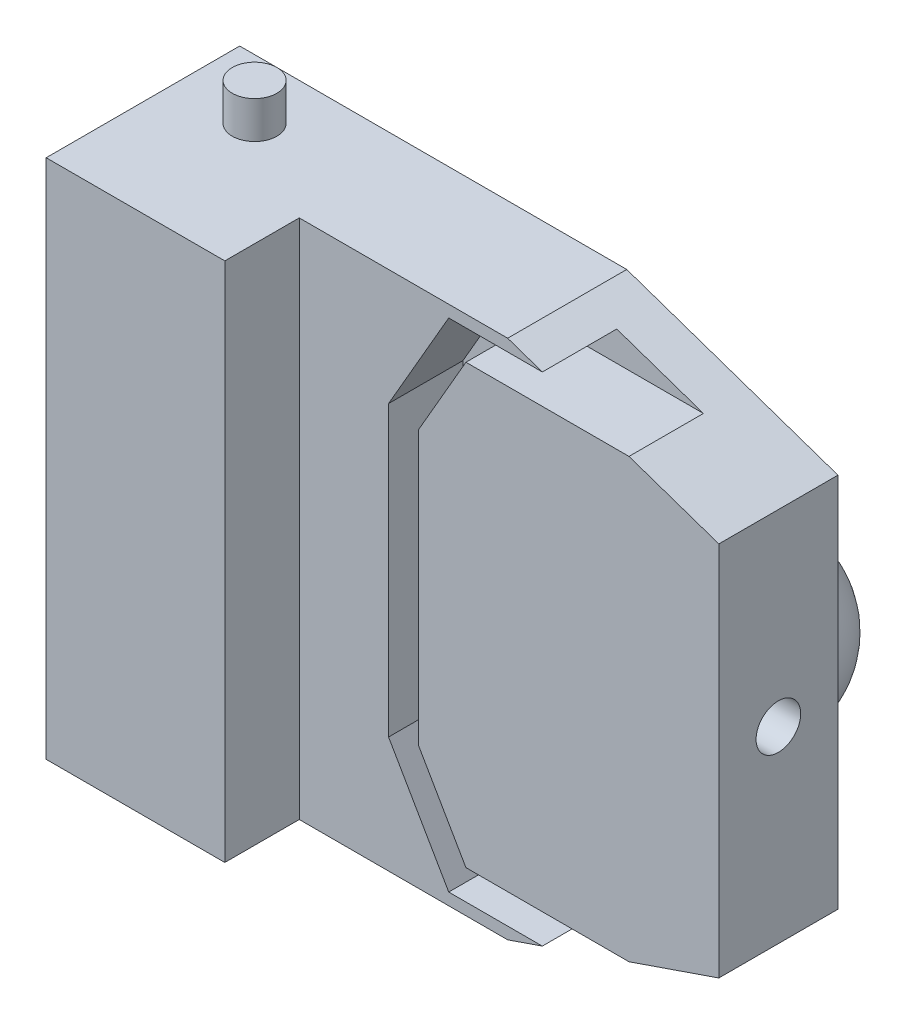
ISO-10303-21;
HEADER;
FILE_DESCRIPTION(('STEP AP214'),'2;1');
FILE_NAME('part.step','',(''),(''),'','','');
FILE_SCHEMA(('AUTOMOTIVE_DESIGN { 1 0 10303 214 1 1 1 1 }'));
ENDSEC;
DATA;
#1=APPLICATION_CONTEXT('core data for automotive mechanical design processes');
#2=APPLICATION_PROTOCOL_DEFINITION('international standard','automotive_design',2000,#1);
#3=PRODUCT_CONTEXT('',#1,'mechanical');
#4=PRODUCT('Part','Part','',(#3));
#5=PRODUCT_RELATED_PRODUCT_CATEGORY('part','',(#4));
#6=PRODUCT_DEFINITION_FORMATION('','',#4);
#7=PRODUCT_DEFINITION_CONTEXT('part definition',#1,'design');
#8=PRODUCT_DEFINITION('design','',#6,#7);
#9=PRODUCT_DEFINITION_SHAPE('','',#8);
#10=(LENGTH_UNIT() NAMED_UNIT(*) SI_UNIT(.MILLI.,.METRE.));
#11=(NAMED_UNIT(*) PLANE_ANGLE_UNIT() SI_UNIT($,.RADIAN.));
#12=(NAMED_UNIT(*) SI_UNIT($,.STERADIAN.) SOLID_ANGLE_UNIT());
#13=UNCERTAINTY_MEASURE_WITH_UNIT(LENGTH_MEASURE(1.E-05),#10,'distance_accuracy_value','');
#14=(GEOMETRIC_REPRESENTATION_CONTEXT(3) GLOBAL_UNCERTAINTY_ASSIGNED_CONTEXT((#13)) GLOBAL_UNIT_ASSIGNED_CONTEXT((#10,
#11,#12)) REPRESENTATION_CONTEXT('',''));
#15=CARTESIAN_POINT('',(0.,0.,0.));
#16=DIRECTION('',(0.,0.,1.));
#17=DIRECTION('',(1.,0.,0.));
#18=AXIS2_PLACEMENT_3D('',#15,#16,#17);
#19=CARTESIAN_POINT('',(0.,0.,80.));
#20=DIRECTION('',(0.,0.,-1.));
#21=DIRECTION('',(-1.,0.,0.));
#22=AXIS2_PLACEMENT_3D('',#19,#20,#21);
#23=PLANE('',#22);
#24=DIRECTION('',(0.,1.,0.));
#25=VECTOR('',#24,1.);
#26=CARTESIAN_POINT('',(-140.,0.,80.));
#27=LINE('',#26,#25);
#28=CARTESIAN_POINT('',(-140.,-350.,80.));
#29=VERTEX_POINT('',#28);
#30=CARTESIAN_POINT('',(-140.,0.,80.));
#31=VERTEX_POINT('',#30);
#32=EDGE_CURVE('E195',#29,#31,#27,.T.);
#33=ORIENTED_EDGE('',*,*,#32,.F.);
#34=DIRECTION('',(1.,0.,0.));
#35=VECTOR('',#34,1.);
#36=CARTESIAN_POINT('',(-260.,-350.,80.));
#37=LINE('',#36,#35);
#38=CARTESIAN_POINT('',(0.,-350.,80.));
#39=VERTEX_POINT('',#38);
#40=EDGE_CURVE('E316',#29,#39,#37,.T.);
#41=ORIENTED_EDGE('',*,*,#40,.T.);
#42=DIRECTION('',(0.945753856911225,0.324884044141201,0.));
#43=VECTOR('',#42,1.);
#44=CARTESIAN_POINT('',(141.863078536684,-301.26739337882,80.));
#45=LINE('',#44,#43);
#46=CARTESIAN_POINT('',(23.2884039451364,-342.,80.));
#47=VERTEX_POINT('',#46);
#48=EDGE_CURVE('E319',#39,#47,#45,.T.);
#49=ORIENTED_EDGE('',*,*,#48,.T.);
#50=DIRECTION('',(-1.,0.,0.));
#51=VECTOR('',#50,1.);
#52=CARTESIAN_POINT('',(23.2884039451364,-342.,80.));
#53=LINE('',#52,#51);
#54=CARTESIAN_POINT('',(-39.5854811567264,-342.,80.));
#55=VERTEX_POINT('',#54);
#56=EDGE_CURVE('E210',#47,#55,#53,.T.);
#57=ORIENTED_EDGE('',*,*,#56,.T.);
#58=DIRECTION('',(-0.499999999999998,0.86602540378444,0.));
#59=VECTOR('',#58,1.);
#60=CARTESIAN_POINT('',(-39.5854811567264,-342.,80.));
#61=LINE('',#60,#59);
#62=CARTESIAN_POINT('',(-80.,-272.,80.));
#63=VERTEX_POINT('',#62);
#64=EDGE_CURVE('E262',#55,#63,#61,.T.);
#65=ORIENTED_EDGE('',*,*,#64,.T.);
#66=DIRECTION('',(0.,1.,0.));
#67=VECTOR('',#66,1.);
#68=CARTESIAN_POINT('',(-80.,-272.,80.));
#69=LINE('',#68,#67);
#70=CARTESIAN_POINT('',(-80.,-78.,80.));
#71=VERTEX_POINT('',#70);
#72=EDGE_CURVE('E259',#63,#71,#69,.T.);
#73=ORIENTED_EDGE('',*,*,#72,.T.);
#74=DIRECTION('',(-0.499999999999998,-0.86602540378444,0.));
#75=VECTOR('',#74,1.);
#76=CARTESIAN_POINT('',(-39.5854811567264,-8.00000000000001,80.));
#77=LINE('',#76,#75);
#78=CARTESIAN_POINT('',(-39.5854811567264,-8.00000000000001,80.));
#79=VERTEX_POINT('',#78);
#80=EDGE_CURVE('E256',#79,#71,#77,.T.);
#81=ORIENTED_EDGE('',*,*,#80,.F.);
#82=DIRECTION('',(-1.,0.,0.));
#83=VECTOR('',#82,1.);
#84=CARTESIAN_POINT('',(23.2884039451364,-8.00000000000001,80.));
#85=LINE('',#84,#83);
#86=CARTESIAN_POINT('',(23.2884039451364,-8.00000000000001,80.));
#87=VERTEX_POINT('',#86);
#88=EDGE_CURVE('E253',#87,#79,#85,.T.);
#89=ORIENTED_EDGE('',*,*,#88,.F.);
#90=DIRECTION('',(-0.945753856911225,0.324884044141201,0.));
#91=VECTOR('',#90,1.);
#92=CARTESIAN_POINT('',(0.,0.,80.));
#93=LINE('',#92,#91);
#94=CARTESIAN_POINT('',(0.,0.,80.));
#95=VERTEX_POINT('',#94);
#96=EDGE_CURVE('E314',#87,#95,#93,.T.);
#97=ORIENTED_EDGE('',*,*,#96,.T.);
#98=DIRECTION('',(-1.,0.,0.));
#99=VECTOR('',#98,1.);
#100=CARTESIAN_POINT('',(0.,0.,80.));
#101=LINE('',#100,#99);
#102=EDGE_CURVE('E53',#95,#31,#101,.T.);
#103=ORIENTED_EDGE('',*,*,#102,.T.);
#104=EDGE_LOOP('',(#33,#41,#49,#57,#65,#73,#81,#89,#97,#103));
#105=FACE_BOUND('',#104,.T.);
#106=ADVANCED_FACE('F38',(#105),#23,.F.);
#107=CARTESIAN_POINT('',(0.,0.,80.));
#108=DIRECTION('',(-0.324884044141201,-0.945753856911225,0.));
#109=DIRECTION('',(0.945753856911225,-0.324884044141201,0.));
#110=AXIS2_PLACEMENT_3D('',#107,#108,#109);
#111=PLANE('',#110);
#112=ORIENTED_EDGE('',*,*,#96,.F.);
#113=DIRECTION('',(0.,0.,1.));
#114=VECTOR('',#113,1.);
#115=CARTESIAN_POINT('',(23.2884039451364,-8.00000000000001,30.));
#116=LINE('',#115,#114);
#117=CARTESIAN_POINT('',(23.2884039451364,-8.00000000000001,30.));
#118=VERTEX_POINT('',#117);
#119=EDGE_CURVE('E281',#118,#87,#116,.T.);
#120=ORIENTED_EDGE('',*,*,#119,.F.);
#121=DIRECTION('',(0.945753856911225,-0.324884044141201,0.));
#122=VECTOR('',#121,1.);
#123=CARTESIAN_POINT('',(23.2884039451364,-8.00000000000001,30.));
#124=LINE('',#123,#122);
#125=CARTESIAN_POINT('',(81.5094138079772,-28.,30.));
#126=VERTEX_POINT('',#125);
#127=EDGE_CURVE('E222',#118,#126,#124,.T.);
#128=ORIENTED_EDGE('',*,*,#127,.T.);
#129=DIRECTION('',(0.,0.,1.));
#130=VECTOR('',#129,1.);
#131=CARTESIAN_POINT('',(81.5094138079772,-28.,30.));
#132=LINE('',#131,#130);
#133=CARTESIAN_POINT('',(81.5094138079772,-28.,80.));
#134=VERTEX_POINT('',#133);
#135=EDGE_CURVE('E283',#126,#134,#132,.T.);
#136=ORIENTED_EDGE('',*,*,#135,.T.);
#137=CARTESIAN_POINT('',(141.863078536684,-48.7326066211802,80.));
#138=VERTEX_POINT('',#137);
#139=EDGE_CURVE('E311',#138,#134,#93,.T.);
#140=ORIENTED_EDGE('',*,*,#139,.F.);
#141=DIRECTION('',(0.,0.,-1.));
#142=VECTOR('',#141,1.);
#143=CARTESIAN_POINT('',(141.863078536684,-48.7326066211802,80.));
#144=LINE('',#143,#142);
#145=CARTESIAN_POINT('',(141.863078536684,-48.7326066211802,0.));
#146=VERTEX_POINT('',#145);
#147=EDGE_CURVE('E324',#138,#146,#144,.T.);
#148=ORIENTED_EDGE('',*,*,#147,.T.);
#149=DIRECTION('',(-0.945753856911225,0.324884044141201,0.));
#150=VECTOR('',#149,1.);
#151=CARTESIAN_POINT('',(0.,0.,0.));
#152=LINE('',#151,#150);
#153=CARTESIAN_POINT('',(0.,0.,0.));
#154=VERTEX_POINT('',#153);
#155=EDGE_CURVE('E308',#146,#154,#152,.T.);
#156=ORIENTED_EDGE('',*,*,#155,.T.);
#157=DIRECTION('',(0.,0.,-1.));
#158=VECTOR('',#157,1.);
#159=CARTESIAN_POINT('',(0.,0.,80.));
#160=LINE('',#159,#158);
#161=EDGE_CURVE('E11',#95,#154,#160,.T.);
#162=ORIENTED_EDGE('',*,*,#161,.F.);
#163=EDGE_LOOP('',(#112,#120,#128,#136,#140,#148,#156,#162));
#164=FACE_BOUND('',#163,.T.);
#165=ADVANCED_FACE('F40',(#164),#111,.F.);
#166=CARTESIAN_POINT('',(0.,0.,80.));
#167=DIRECTION('',(0.,-1.,0.));
#168=DIRECTION('',(0.,0.,-1.));
#169=AXIS2_PLACEMENT_3D('',#166,#167,#168);
#170=PLANE('',#169);
#171=CARTESIAN_POINT('',(-210.,0.,40.));
#172=DIRECTION('',(0.,-1.,0.));
#173=DIRECTION('',(0.,0.,-1.));
#174=AXIS2_PLACEMENT_3D('',#171,#172,#173);
#175=CIRCLE('',#174,15.);
#176=CARTESIAN_POINT('',(-210.,0.,25.));
#177=VERTEX_POINT('',#176);
#178=EDGE_CURVE('E296',#177,#177,#175,.T.);
#179=ORIENTED_EDGE('',*,*,#178,.T.);
#180=EDGE_LOOP('',(#179));
#181=FACE_BOUND('',#180,.T.);
#182=DIRECTION('',(-1.,0.,0.));
#183=VECTOR('',#182,1.);
#184=CARTESIAN_POINT('',(0.,0.,0.));
#185=LINE('',#184,#183);
#186=CARTESIAN_POINT('',(-260.,0.,0.));
#187=VERTEX_POINT('',#186);
#188=EDGE_CURVE('E327',#154,#187,#185,.T.);
#189=ORIENTED_EDGE('',*,*,#188,.T.);
#190=DIRECTION('',(0.,0.,-1.));
#191=VECTOR('',#190,1.);
#192=CARTESIAN_POINT('',(-260.,0.,80.));
#193=LINE('',#192,#191);
#194=CARTESIAN_POINT('',(-260.,0.,130.));
#195=VERTEX_POINT('',#194);
#196=EDGE_CURVE('E46',#195,#187,#193,.T.);
#197=ORIENTED_EDGE('',*,*,#196,.F.);
#198=DIRECTION('',(-1.,0.,0.));
#199=VECTOR('',#198,1.);
#200=CARTESIAN_POINT('',(-140.,0.,130.));
#201=LINE('',#200,#199);
#202=CARTESIAN_POINT('',(-140.,0.,130.));
#203=VERTEX_POINT('',#202);
#204=EDGE_CURVE('E175',#203,#195,#201,.T.);
#205=ORIENTED_EDGE('',*,*,#204,.F.);
#206=DIRECTION('',(0.,0.,-1.));
#207=VECTOR('',#206,1.);
#208=CARTESIAN_POINT('',(-140.,0.,130.));
#209=LINE('',#208,#207);
#210=EDGE_CURVE('E179',#203,#31,#209,.T.);
#211=ORIENTED_EDGE('',*,*,#210,.T.);
#212=ORIENTED_EDGE('',*,*,#102,.F.);
#213=ORIENTED_EDGE('',*,*,#161,.T.);
#214=EDGE_LOOP('',(#189,#197,#205,#211,#212,#213));
#215=FACE_BOUND('',#214,.T.);
#216=ADVANCED_FACE('F177',(#181,#215),#170,.F.);
#217=CARTESIAN_POINT('',(-260.,0.,80.));
#218=DIRECTION('',(1.,0.,0.));
#219=DIRECTION('',(0.,0.,-1.));
#220=AXIS2_PLACEMENT_3D('',#217,#218,#219);
#221=PLANE('',#220);
#222=DIRECTION('',(0.,-1.,0.));
#223=VECTOR('',#222,1.);
#224=CARTESIAN_POINT('',(-260.,0.,0.));
#225=LINE('',#224,#223);
#226=CARTESIAN_POINT('',(-260.,-350.,0.));
#227=VERTEX_POINT('',#226);
#228=EDGE_CURVE('E329',#187,#227,#225,.T.);
#229=ORIENTED_EDGE('',*,*,#228,.T.);
#230=DIRECTION('',(0.,0.,-1.));
#231=VECTOR('',#230,1.);
#232=CARTESIAN_POINT('',(-260.,-350.,80.));
#233=LINE('',#232,#231);
#234=CARTESIAN_POINT('',(-260.,-350.,130.));
#235=VERTEX_POINT('',#234);
#236=EDGE_CURVE('E345',#235,#227,#233,.T.);
#237=ORIENTED_EDGE('',*,*,#236,.F.);
#238=DIRECTION('',(0.,-1.,0.));
#239=VECTOR('',#238,1.);
#240=CARTESIAN_POINT('',(-260.,0.,130.));
#241=LINE('',#240,#239);
#242=EDGE_CURVE('E185',#195,#235,#241,.T.);
#243=ORIENTED_EDGE('',*,*,#242,.F.);
#244=ORIENTED_EDGE('',*,*,#196,.T.);
#245=EDGE_LOOP('',(#229,#237,#243,#244));
#246=FACE_BOUND('',#245,.T.);
#247=ADVANCED_FACE('F349',(#246),#221,.F.);
#248=CARTESIAN_POINT('',(-260.,-350.,80.));
#249=DIRECTION('',(0.,1.,0.));
#250=DIRECTION('',(0.,0.,1.));
#251=AXIS2_PLACEMENT_3D('',#248,#249,#250);
#252=PLANE('',#251);
#253=CARTESIAN_POINT('',(-210.,-350.,40.));
#254=DIRECTION('',(0.,1.,0.));
#255=DIRECTION('',(0.,0.,1.));
#256=AXIS2_PLACEMENT_3D('',#253,#254,#255);
#257=CIRCLE('',#256,15.);
#258=CARTESIAN_POINT('',(-210.,-350.,55.));
#259=VERTEX_POINT('',#258);
#260=EDGE_CURVE('E302',#259,#259,#257,.T.);
#261=ORIENTED_EDGE('',*,*,#260,.T.);
#262=EDGE_LOOP('',(#261));
#263=FACE_BOUND('',#262,.T.);
#264=DIRECTION('',(1.,0.,0.));
#265=VECTOR('',#264,1.);
#266=CARTESIAN_POINT('',(-260.,-350.,0.));
#267=LINE('',#266,#265);
#268=CARTESIAN_POINT('',(0.,-350.,0.));
#269=VERTEX_POINT('',#268);
#270=EDGE_CURVE('E331',#227,#269,#267,.T.);
#271=ORIENTED_EDGE('',*,*,#270,.T.);
#272=DIRECTION('',(0.,0.,-1.));
#273=VECTOR('',#272,1.);
#274=CARTESIAN_POINT('',(0.,-350.,80.));
#275=LINE('',#274,#273);
#276=EDGE_CURVE('E342',#39,#269,#275,.T.);
#277=ORIENTED_EDGE('',*,*,#276,.F.);
#278=ORIENTED_EDGE('',*,*,#40,.F.);
#279=DIRECTION('',(0.,0.,-1.));
#280=VECTOR('',#279,1.);
#281=CARTESIAN_POINT('',(-140.,-350.,130.));
#282=LINE('',#281,#280);
#283=CARTESIAN_POINT('',(-140.,-350.,130.));
#284=VERTEX_POINT('',#283);
#285=EDGE_CURVE('E199',#284,#29,#282,.T.);
#286=ORIENTED_EDGE('',*,*,#285,.F.);
#287=DIRECTION('',(1.,0.,0.));
#288=VECTOR('',#287,1.);
#289=CARTESIAN_POINT('',(-140.,-350.,130.));
#290=LINE('',#289,#288);
#291=EDGE_CURVE('E191',#235,#284,#290,.T.);
#292=ORIENTED_EDGE('',*,*,#291,.F.);
#293=ORIENTED_EDGE('',*,*,#236,.T.);
#294=EDGE_LOOP('',(#271,#277,#278,#286,#292,#293));
#295=FACE_BOUND('',#294,.T.);
#296=ADVANCED_FACE('F358',(#263,#295),#252,.F.);
#297=CARTESIAN_POINT('',(141.863078536684,-301.26739337882,80.));
#298=DIRECTION('',(-0.324884044141201,0.945753856911225,0.));
#299=DIRECTION('',(-0.945753856911225,-0.324884044141201,0.));
#300=AXIS2_PLACEMENT_3D('',#297,#298,#299);
#301=PLANE('',#300);
#302=CARTESIAN_POINT('',(81.5094138079773,-322.,80.));
#303=VERTEX_POINT('',#302);
#304=CARTESIAN_POINT('',(141.863078536684,-301.26739337882,80.));
#305=VERTEX_POINT('',#304);
#306=EDGE_CURVE('E318',#303,#305,#45,.T.);
#307=ORIENTED_EDGE('',*,*,#306,.F.);
#308=DIRECTION('',(0.,0.,1.));
#309=VECTOR('',#308,1.);
#310=CARTESIAN_POINT('',(81.5094138079773,-322.,30.));
#311=LINE('',#310,#309);
#312=CARTESIAN_POINT('',(81.5094138079773,-322.,30.));
#313=VERTEX_POINT('',#312);
#314=EDGE_CURVE('E267',#313,#303,#311,.T.);
#315=ORIENTED_EDGE('',*,*,#314,.F.);
#316=DIRECTION('',(0.945753856911225,0.324884044141201,0.));
#317=VECTOR('',#316,1.);
#318=CARTESIAN_POINT('',(23.2884039451364,-342.,30.));
#319=LINE('',#318,#317);
#320=CARTESIAN_POINT('',(23.2884039451364,-342.,30.));
#321=VERTEX_POINT('',#320);
#322=EDGE_CURVE('E237',#321,#313,#319,.T.);
#323=ORIENTED_EDGE('',*,*,#322,.F.);
#324=DIRECTION('',(0.,0.,1.));
#325=VECTOR('',#324,1.);
#326=CARTESIAN_POINT('',(23.2884039451364,-342.,30.));
#327=LINE('',#326,#325);
#328=EDGE_CURVE('E270',#321,#47,#327,.T.);
#329=ORIENTED_EDGE('',*,*,#328,.T.);
#330=ORIENTED_EDGE('',*,*,#48,.F.);
#331=ORIENTED_EDGE('',*,*,#276,.T.);
#332=DIRECTION('',(0.945753856911225,0.324884044141201,0.));
#333=VECTOR('',#332,1.);
#334=CARTESIAN_POINT('',(141.863078536684,-301.26739337882,0.));
#335=LINE('',#334,#333);
#336=CARTESIAN_POINT('',(141.863078536684,-301.26739337882,0.));
#337=VERTEX_POINT('',#336);
#338=EDGE_CURVE('E333',#269,#337,#335,.T.);
#339=ORIENTED_EDGE('',*,*,#338,.T.);
#340=DIRECTION('',(0.,0.,-1.));
#341=VECTOR('',#340,1.);
#342=CARTESIAN_POINT('',(141.863078536684,-301.26739337882,80.));
#343=LINE('',#342,#341);
#344=EDGE_CURVE('E339',#305,#337,#343,.T.);
#345=ORIENTED_EDGE('',*,*,#344,.F.);
#346=EDGE_LOOP('',(#307,#315,#323,#329,#330,#331,#339,#345));
#347=FACE_BOUND('',#346,.T.);
#348=ADVANCED_FACE('F362',(#347),#301,.F.);
#349=CARTESIAN_POINT('',(141.863078536684,-48.7326066211802,80.));
#350=DIRECTION('',(-1.,0.,0.));
#351=DIRECTION('',(0.,0.,1.));
#352=AXIS2_PLACEMENT_3D('',#349,#350,#351);
#353=PLANE('',#352);
#354=CARTESIAN_POINT('',(141.863078536684,-175.,40.));
#355=DIRECTION('',(1.,0.,0.));
#356=DIRECTION('',(0.,0.,-1.));
#357=AXIS2_PLACEMENT_3D('',#354,#355,#356);
#358=CIRCLE('',#357,15.);
#359=CARTESIAN_POINT('',(141.863078536684,-175.,25.));
#360=VERTEX_POINT('',#359);
#361=EDGE_CURVE('E269',#360,#360,#358,.T.);
#362=ORIENTED_EDGE('',*,*,#361,.F.);
#363=EDGE_LOOP('',(#362));
#364=FACE_BOUND('',#363,.T.);
#365=DIRECTION('',(0.,1.,0.));
#366=VECTOR('',#365,1.);
#367=CARTESIAN_POINT('',(141.863078536684,-48.7326066211802,0.));
#368=LINE('',#367,#366);
#369=EDGE_CURVE('E335',#337,#146,#368,.T.);
#370=ORIENTED_EDGE('',*,*,#369,.T.);
#371=ORIENTED_EDGE('',*,*,#147,.F.);
#372=DIRECTION('',(0.,1.,0.));
#373=VECTOR('',#372,1.);
#374=CARTESIAN_POINT('',(141.863078536684,-48.7326066211802,80.));
#375=LINE('',#374,#373);
#376=EDGE_CURVE('E322',#305,#138,#375,.T.);
#377=ORIENTED_EDGE('',*,*,#376,.F.);
#378=ORIENTED_EDGE('',*,*,#344,.T.);
#379=EDGE_LOOP('',(#370,#371,#377,#378));
#380=FACE_BOUND('',#379,.T.);
#381=ADVANCED_FACE('F396',(#364,#380),#353,.F.);
#382=DIRECTION('',(-0.499999999999998,0.866025403784439,0.));
#383=VECTOR('',#382,1.);
#384=CARTESIAN_POINT('',(-28.0384757729339,-322.,80.));
#385=LINE('',#384,#383);
#386=CARTESIAN_POINT('',(-28.0384757729339,-322.,80.));
#387=VERTEX_POINT('',#386);
#388=CARTESIAN_POINT('',(-60.,-266.641016151378,80.));
#389=VERTEX_POINT('',#388);
#390=EDGE_CURVE('E242',#387,#389,#385,.T.);
#391=ORIENTED_EDGE('',*,*,#390,.F.);
#392=DIRECTION('',(-1.,0.,0.));
#393=VECTOR('',#392,1.);
#394=CARTESIAN_POINT('',(81.5094138079773,-322.,80.));
#395=LINE('',#394,#393);
#396=EDGE_CURVE('E61',#303,#387,#395,.T.);
#397=ORIENTED_EDGE('',*,*,#396,.F.);
#398=ORIENTED_EDGE('',*,*,#306,.T.);
#399=ORIENTED_EDGE('',*,*,#376,.T.);
#400=ORIENTED_EDGE('',*,*,#139,.T.);
#401=DIRECTION('',(1.,0.,0.));
#402=VECTOR('',#401,1.);
#403=CARTESIAN_POINT('',(-28.0384757729339,-28.,80.));
#404=LINE('',#403,#402);
#405=CARTESIAN_POINT('',(-28.0384757729339,-28.,80.));
#406=VERTEX_POINT('',#405);
#407=EDGE_CURVE('E251',#406,#134,#404,.T.);
#408=ORIENTED_EDGE('',*,*,#407,.F.);
#409=DIRECTION('',(0.499999999999998,0.86602540378444,0.));
#410=VECTOR('',#409,1.);
#411=CARTESIAN_POINT('',(-60.,-83.3589838486224,80.));
#412=LINE('',#411,#410);
#413=CARTESIAN_POINT('',(-60.,-83.3589838486224,80.));
#414=VERTEX_POINT('',#413);
#415=EDGE_CURVE('E248',#414,#406,#412,.T.);
#416=ORIENTED_EDGE('',*,*,#415,.F.);
#417=DIRECTION('',(0.,1.,0.));
#418=VECTOR('',#417,1.);
#419=CARTESIAN_POINT('',(-60.,-266.641016151378,80.));
#420=LINE('',#419,#418);
#421=EDGE_CURVE('E245',#389,#414,#420,.T.);
#422=ORIENTED_EDGE('',*,*,#421,.F.);
#423=EDGE_LOOP('',(#391,#397,#398,#399,#400,#408,#416,#422));
#424=FACE_BOUND('',#423,.T.);
#425=ADVANCED_FACE('F401',(#424),#23,.F.);
#426=CARTESIAN_POINT('',(0.,0.,0.));
#427=DIRECTION('',(0.,0.,-1.));
#428=DIRECTION('',(-1.,0.,0.));
#429=AXIS2_PLACEMENT_3D('',#426,#427,#428);
#430=PLANE('',#429);
#431=CARTESIAN_POINT('',(71.8630785366838,-175.,0.));
#432=DIRECTION('',(0.,0.,1.));
#433=DIRECTION('',(-1.,0.,0.));
#434=AXIS2_PLACEMENT_3D('',#431,#432,#433);
#435=CIRCLE('',#434,60.);
#436=CARTESIAN_POINT('',(11.8630785366838,-175.,0.));
#437=VERTEX_POINT('',#436);
#438=EDGE_CURVE('E198',#437,#437,#435,.T.);
#439=ORIENTED_EDGE('',*,*,#438,.T.);
#440=EDGE_LOOP('',(#439));
#441=FACE_BOUND('',#440,.T.);
#442=ORIENTED_EDGE('',*,*,#155,.F.);
#443=ORIENTED_EDGE('',*,*,#369,.F.);
#444=ORIENTED_EDGE('',*,*,#338,.F.);
#445=ORIENTED_EDGE('',*,*,#270,.F.);
#446=ORIENTED_EDGE('',*,*,#228,.F.);
#447=ORIENTED_EDGE('',*,*,#188,.F.);
#448=EDGE_LOOP('',(#442,#443,#444,#445,#446,#447));
#449=FACE_BOUND('',#448,.T.);
#450=ADVANCED_FACE('F353',(#441,#449),#430,.T.);
#451=CARTESIAN_POINT('',(-210.,-375.,40.));
#452=DIRECTION('',(0.,1.,0.));
#453=DIRECTION('',(-1.,0.,0.));
#454=AXIS2_PLACEMENT_3D('',#451,#452,#453);
#455=CYLINDRICAL_SURFACE('',#454,15.);
#456=CARTESIAN_POINT('',(-210.,-375.,40.));
#457=DIRECTION('',(0.,1.,0.));
#458=DIRECTION('',(0.,0.,1.));
#459=AXIS2_PLACEMENT_3D('',#456,#457,#458);
#460=CIRCLE('',#459,15.);
#461=CARTESIAN_POINT('',(-210.,-375.,55.));
#462=VERTEX_POINT('',#461);
#463=EDGE_CURVE('E305',#462,#462,#460,.T.);
#464=ORIENTED_EDGE('',*,*,#463,.T.);
#465=EDGE_LOOP('',(#464));
#466=FACE_BOUND('',#465,.T.);
#467=ORIENTED_EDGE('',*,*,#260,.F.);
#468=EDGE_LOOP('',(#467));
#469=FACE_BOUND('',#468,.T.);
#470=ADVANCED_FACE('F442',(#466,#469),#455,.T.);
#471=CARTESIAN_POINT('',(-210.,-375.,40.));
#472=DIRECTION('',(0.,1.,0.));
#473=DIRECTION('',(0.,0.,1.));
#474=AXIS2_PLACEMENT_3D('',#471,#472,#473);
#475=PLANE('',#474);
#476=ORIENTED_EDGE('',*,*,#463,.F.);
#477=EDGE_LOOP('',(#476));
#478=FACE_BOUND('',#477,.T.);
#479=ADVANCED_FACE('F465',(#478),#475,.F.);
#480=CARTESIAN_POINT('',(-210.,25.,40.));
#481=DIRECTION('',(0.,-1.,0.));
#482=DIRECTION('',(1.,0.,0.));
#483=AXIS2_PLACEMENT_3D('',#480,#481,#482);
#484=CYLINDRICAL_SURFACE('',#483,15.);
#485=CARTESIAN_POINT('',(-210.,25.,40.));
#486=DIRECTION('',(0.,-1.,0.));
#487=DIRECTION('',(0.,0.,-1.));
#488=AXIS2_PLACEMENT_3D('',#485,#486,#487);
#489=CIRCLE('',#488,15.);
#490=CARTESIAN_POINT('',(-210.,25.,25.));
#491=VERTEX_POINT('',#490);
#492=EDGE_CURVE('E299',#491,#491,#489,.T.);
#493=ORIENTED_EDGE('',*,*,#492,.T.);
#494=EDGE_LOOP('',(#493));
#495=FACE_BOUND('',#494,.T.);
#496=ORIENTED_EDGE('',*,*,#178,.F.);
#497=EDGE_LOOP('',(#496));
#498=FACE_BOUND('',#497,.T.);
#499=ADVANCED_FACE('F462',(#495,#498),#484,.T.);
#500=CARTESIAN_POINT('',(-210.,25.,40.));
#501=DIRECTION('',(0.,-1.,0.));
#502=DIRECTION('',(0.,0.,-1.));
#503=AXIS2_PLACEMENT_3D('',#500,#501,#502);
#504=PLANE('',#503);
#505=ORIENTED_EDGE('',*,*,#492,.F.);
#506=EDGE_LOOP('',(#505));
#507=FACE_BOUND('',#506,.T.);
#508=ADVANCED_FACE('F464',(#507),#504,.F.);
#509=CARTESIAN_POINT('',(111.863078536684,-175.,40.));
#510=DIRECTION('',(1.,0.,0.));
#511=DIRECTION('',(0.,0.,-1.));
#512=AXIS2_PLACEMENT_3D('',#509,#510,#511);
#513=CYLINDRICAL_SURFACE('',#512,15.);
#514=CARTESIAN_POINT('',(111.863078536684,-175.,40.));
#515=DIRECTION('',(1.,0.,0.));
#516=DIRECTION('',(0.,0.,-1.));
#517=AXIS2_PLACEMENT_3D('',#514,#515,#516);
#518=CIRCLE('',#517,15.);
#519=CARTESIAN_POINT('',(111.863078536684,-175.,25.));
#520=VERTEX_POINT('',#519);
#521=EDGE_CURVE('E293',#520,#520,#518,.T.);
#522=ORIENTED_EDGE('',*,*,#521,.F.);
#523=EDGE_LOOP('',(#522));
#524=FACE_BOUND('',#523,.T.);
#525=ORIENTED_EDGE('',*,*,#361,.T.);
#526=EDGE_LOOP('',(#525));
#527=FACE_BOUND('',#526,.T.);
#528=ADVANCED_FACE('F472',(#524,#527),#513,.F.);
#529=CARTESIAN_POINT('',(111.863078536684,-175.,40.));
#530=DIRECTION('',(1.,0.,0.));
#531=DIRECTION('',(0.,0.,-1.));
#532=AXIS2_PLACEMENT_3D('',#529,#530,#531);
#533=PLANE('',#532);
#534=ORIENTED_EDGE('',*,*,#521,.T.);
#535=EDGE_LOOP('',(#534));
#536=FACE_BOUND('',#535,.T.);
#537=ADVANCED_FACE('F516',(#536),#533,.T.);
#538=CARTESIAN_POINT('',(81.5094138079773,-322.,30.));
#539=DIRECTION('',(0.,1.,0.));
#540=DIRECTION('',(0.,0.,1.));
#541=AXIS2_PLACEMENT_3D('',#538,#539,#540);
#542=PLANE('',#541);
#543=ORIENTED_EDGE('',*,*,#396,.T.);
#544=DIRECTION('',(0.,0.,1.));
#545=VECTOR('',#544,1.);
#546=CARTESIAN_POINT('',(-28.0384757729339,-322.,30.));
#547=LINE('',#546,#545);
#548=CARTESIAN_POINT('',(-28.0384757729339,-322.,30.));
#549=VERTEX_POINT('',#548);
#550=EDGE_CURVE('E240',#549,#387,#547,.T.);
#551=ORIENTED_EDGE('',*,*,#550,.F.);
#552=DIRECTION('',(-1.,0.,0.));
#553=VECTOR('',#552,1.);
#554=CARTESIAN_POINT('',(81.5094138079773,-322.,30.));
#555=LINE('',#554,#553);
#556=EDGE_CURVE('E206',#313,#549,#555,.T.);
#557=ORIENTED_EDGE('',*,*,#556,.F.);
#558=ORIENTED_EDGE('',*,*,#314,.T.);
#559=EDGE_LOOP('',(#543,#551,#557,#558));
#560=FACE_BOUND('',#559,.T.);
#561=ADVANCED_FACE('F408',(#560),#542,.F.);
#562=CARTESIAN_POINT('',(23.2884039451364,-342.,30.));
#563=DIRECTION('',(0.,1.,0.));
#564=DIRECTION('',(0.,0.,1.));
#565=AXIS2_PLACEMENT_3D('',#562,#563,#564);
#566=PLANE('',#565);
#567=ORIENTED_EDGE('',*,*,#56,.F.);
#568=ORIENTED_EDGE('',*,*,#328,.F.);
#569=DIRECTION('',(-1.,0.,0.));
#570=VECTOR('',#569,1.);
#571=CARTESIAN_POINT('',(23.2884039451364,-342.,30.));
#572=LINE('',#571,#570);
#573=CARTESIAN_POINT('',(-39.5854811567264,-342.,30.));
#574=VERTEX_POINT('',#573);
#575=EDGE_CURVE('E235',#321,#574,#572,.T.);
#576=ORIENTED_EDGE('',*,*,#575,.T.);
#577=DIRECTION('',(0.,0.,1.));
#578=VECTOR('',#577,1.);
#579=CARTESIAN_POINT('',(-39.5854811567264,-342.,30.));
#580=LINE('',#579,#578);
#581=EDGE_CURVE('E273',#574,#55,#580,.T.);
#582=ORIENTED_EDGE('',*,*,#581,.T.);
#583=EDGE_LOOP('',(#567,#568,#576,#582));
#584=FACE_BOUND('',#583,.T.);
#585=ADVANCED_FACE('F369',(#584),#566,.T.);
#586=CARTESIAN_POINT('',(-39.5854811567264,-342.,30.));
#587=DIRECTION('',(0.86602540378444,0.499999999999999,0.));
#588=DIRECTION('',(-0.499999999999999,0.86602540378444,0.));
#589=AXIS2_PLACEMENT_3D('',#586,#587,#588);
#590=PLANE('',#589);
#591=ORIENTED_EDGE('',*,*,#64,.F.);
#592=ORIENTED_EDGE('',*,*,#581,.F.);
#593=DIRECTION('',(-0.499999999999998,0.86602540378444,0.));
#594=VECTOR('',#593,1.);
#595=CARTESIAN_POINT('',(-39.5854811567264,-342.,30.));
#596=LINE('',#595,#594);
#597=CARTESIAN_POINT('',(-80.,-272.,30.));
#598=VERTEX_POINT('',#597);
#599=EDGE_CURVE('E233',#574,#598,#596,.T.);
#600=ORIENTED_EDGE('',*,*,#599,.T.);
#601=DIRECTION('',(0.,0.,1.));
#602=VECTOR('',#601,1.);
#603=CARTESIAN_POINT('',(-80.,-272.,30.));
#604=LINE('',#603,#602);
#605=EDGE_CURVE('E275',#598,#63,#604,.T.);
#606=ORIENTED_EDGE('',*,*,#605,.T.);
#607=EDGE_LOOP('',(#591,#592,#600,#606));
#608=FACE_BOUND('',#607,.T.);
#609=ADVANCED_FACE('F374',(#608),#590,.T.);
#610=CARTESIAN_POINT('',(-80.,-272.,30.));
#611=DIRECTION('',(1.,0.,0.));
#612=DIRECTION('',(0.,0.,-1.));
#613=AXIS2_PLACEMENT_3D('',#610,#611,#612);
#614=PLANE('',#613);
#615=ORIENTED_EDGE('',*,*,#72,.F.);
#616=ORIENTED_EDGE('',*,*,#605,.F.);
#617=DIRECTION('',(0.,1.,0.));
#618=VECTOR('',#617,1.);
#619=CARTESIAN_POINT('',(-80.,-272.,30.));
#620=LINE('',#619,#618);
#621=CARTESIAN_POINT('',(-80.,-78.,30.));
#622=VERTEX_POINT('',#621);
#623=EDGE_CURVE('E231',#598,#622,#620,.T.);
#624=ORIENTED_EDGE('',*,*,#623,.T.);
#625=DIRECTION('',(0.,0.,1.));
#626=VECTOR('',#625,1.);
#627=CARTESIAN_POINT('',(-80.,-78.,30.));
#628=LINE('',#627,#626);
#629=EDGE_CURVE('E277',#622,#71,#628,.T.);
#630=ORIENTED_EDGE('',*,*,#629,.T.);
#631=EDGE_LOOP('',(#615,#616,#624,#630));
#632=FACE_BOUND('',#631,.T.);
#633=ADVANCED_FACE('F379',(#632),#614,.T.);
#634=CARTESIAN_POINT('',(-39.5854811567264,-8.00000000000001,30.));
#635=DIRECTION('',(-0.86602540378444,0.499999999999999,0.));
#636=DIRECTION('',(-0.499999999999999,-0.86602540378444,0.));
#637=AXIS2_PLACEMENT_3D('',#634,#635,#636);
#638=PLANE('',#637);
#639=ORIENTED_EDGE('',*,*,#80,.T.);
#640=ORIENTED_EDGE('',*,*,#629,.F.);
#641=DIRECTION('',(-0.499999999999998,-0.86602540378444,0.));
#642=VECTOR('',#641,1.);
#643=CARTESIAN_POINT('',(-39.5854811567264,-8.00000000000001,30.));
#644=LINE('',#643,#642);
#645=CARTESIAN_POINT('',(-39.5854811567264,-8.00000000000001,30.));
#646=VERTEX_POINT('',#645);
#647=EDGE_CURVE('E228',#646,#622,#644,.T.);
#648=ORIENTED_EDGE('',*,*,#647,.F.);
#649=DIRECTION('',(0.,0.,1.));
#650=VECTOR('',#649,1.);
#651=CARTESIAN_POINT('',(-39.5854811567264,-8.00000000000001,30.));
#652=LINE('',#651,#650);
#653=EDGE_CURVE('E279',#646,#79,#652,.T.);
#654=ORIENTED_EDGE('',*,*,#653,.T.);
#655=EDGE_LOOP('',(#639,#640,#648,#654));
#656=FACE_BOUND('',#655,.T.);
#657=ADVANCED_FACE('F385',(#656),#638,.F.);
#658=CARTESIAN_POINT('',(23.2884039451364,-8.00000000000001,30.));
#659=DIRECTION('',(0.,1.,0.));
#660=DIRECTION('',(0.,0.,1.));
#661=AXIS2_PLACEMENT_3D('',#658,#659,#660);
#662=PLANE('',#661);
#663=ORIENTED_EDGE('',*,*,#88,.T.);
#664=ORIENTED_EDGE('',*,*,#653,.F.);
#665=DIRECTION('',(-1.,0.,0.));
#666=VECTOR('',#665,1.);
#667=CARTESIAN_POINT('',(23.2884039451364,-8.00000000000001,30.));
#668=LINE('',#667,#666);
#669=EDGE_CURVE('E225',#118,#646,#668,.T.);
#670=ORIENTED_EDGE('',*,*,#669,.F.);
#671=ORIENTED_EDGE('',*,*,#119,.T.);
#672=EDGE_LOOP('',(#663,#664,#670,#671));
#673=FACE_BOUND('',#672,.T.);
#674=ADVANCED_FACE('F389',(#673),#662,.F.);
#675=CARTESIAN_POINT('',(-28.0384757729339,-28.,30.));
#676=DIRECTION('',(0.,-1.,0.));
#677=DIRECTION('',(1.,0.,0.));
#678=AXIS2_PLACEMENT_3D('',#675,#676,#677);
#679=PLANE('',#678);
#680=ORIENTED_EDGE('',*,*,#407,.T.);
#681=ORIENTED_EDGE('',*,*,#135,.F.);
#682=DIRECTION('',(1.,0.,0.));
#683=VECTOR('',#682,1.);
#684=CARTESIAN_POINT('',(-28.0384757729339,-28.,30.));
#685=LINE('',#684,#683);
#686=CARTESIAN_POINT('',(-28.0384757729339,-28.,30.));
#687=VERTEX_POINT('',#686);
#688=EDGE_CURVE('E219',#687,#126,#685,.T.);
#689=ORIENTED_EDGE('',*,*,#688,.F.);
#690=DIRECTION('',(0.,0.,1.));
#691=VECTOR('',#690,1.);
#692=CARTESIAN_POINT('',(-28.0384757729339,-28.,30.));
#693=LINE('',#692,#691);
#694=EDGE_CURVE('E286',#687,#406,#693,.T.);
#695=ORIENTED_EDGE('',*,*,#694,.T.);
#696=EDGE_LOOP('',(#680,#681,#689,#695));
#697=FACE_BOUND('',#696,.T.);
#698=ADVANCED_FACE('F414',(#697),#679,.F.);
#699=CARTESIAN_POINT('',(-60.,-83.3589838486224,30.));
#700=DIRECTION('',(0.86602540378444,-0.499999999999998,0.));
#701=DIRECTION('',(0.499999999999998,0.86602540378444,0.));
#702=AXIS2_PLACEMENT_3D('',#699,#700,#701);
#703=PLANE('',#702);
#704=ORIENTED_EDGE('',*,*,#415,.T.);
#705=ORIENTED_EDGE('',*,*,#694,.F.);
#706=DIRECTION('',(0.499999999999998,0.86602540378444,0.));
#707=VECTOR('',#706,1.);
#708=CARTESIAN_POINT('',(-60.,-83.3589838486224,30.));
#709=LINE('',#708,#707);
#710=CARTESIAN_POINT('',(-60.,-83.3589838486224,30.));
#711=VERTEX_POINT('',#710);
#712=EDGE_CURVE('E216',#711,#687,#709,.T.);
#713=ORIENTED_EDGE('',*,*,#712,.F.);
#714=DIRECTION('',(0.,0.,1.));
#715=VECTOR('',#714,1.);
#716=CARTESIAN_POINT('',(-60.,-83.3589838486224,30.));
#717=LINE('',#716,#715);
#718=EDGE_CURVE('E288',#711,#414,#717,.T.);
#719=ORIENTED_EDGE('',*,*,#718,.T.);
#720=EDGE_LOOP('',(#704,#705,#713,#719));
#721=FACE_BOUND('',#720,.T.);
#722=ADVANCED_FACE('F417',(#721),#703,.F.);
#723=CARTESIAN_POINT('',(-60.,-266.641016151378,30.));
#724=DIRECTION('',(1.,0.,0.));
#725=DIRECTION('',(0.,0.,-1.));
#726=AXIS2_PLACEMENT_3D('',#723,#724,#725);
#727=PLANE('',#726);
#728=ORIENTED_EDGE('',*,*,#421,.T.);
#729=ORIENTED_EDGE('',*,*,#718,.F.);
#730=DIRECTION('',(0.,1.,0.));
#731=VECTOR('',#730,1.);
#732=CARTESIAN_POINT('',(-60.,-266.641016151378,30.));
#733=LINE('',#732,#731);
#734=CARTESIAN_POINT('',(-60.,-266.641016151378,30.));
#735=VERTEX_POINT('',#734);
#736=EDGE_CURVE('E213',#735,#711,#733,.T.);
#737=ORIENTED_EDGE('',*,*,#736,.F.);
#738=DIRECTION('',(0.,0.,1.));
#739=VECTOR('',#738,1.);
#740=CARTESIAN_POINT('',(-60.,-266.641016151378,30.));
#741=LINE('',#740,#739);
#742=EDGE_CURVE('E290',#735,#389,#741,.T.);
#743=ORIENTED_EDGE('',*,*,#742,.T.);
#744=EDGE_LOOP('',(#728,#729,#737,#743));
#745=FACE_BOUND('',#744,.T.);
#746=ADVANCED_FACE('F419',(#745),#727,.F.);
#747=CARTESIAN_POINT('',(-28.0384757729339,-322.,30.));
#748=DIRECTION('',(0.866025403784439,0.499999999999998,0.));
#749=DIRECTION('',(-0.499999999999998,0.86602540378444,0.));
#750=AXIS2_PLACEMENT_3D('',#747,#748,#749);
#751=PLANE('',#750);
#752=ORIENTED_EDGE('',*,*,#390,.T.);
#753=ORIENTED_EDGE('',*,*,#742,.F.);
#754=DIRECTION('',(-0.499999999999998,0.866025403784439,0.));
#755=VECTOR('',#754,1.);
#756=CARTESIAN_POINT('',(-28.0384757729339,-322.,30.));
#757=LINE('',#756,#755);
#758=EDGE_CURVE('E209',#549,#735,#757,.T.);
#759=ORIENTED_EDGE('',*,*,#758,.F.);
#760=ORIENTED_EDGE('',*,*,#550,.T.);
#761=EDGE_LOOP('',(#752,#753,#759,#760));
#762=FACE_BOUND('',#761,.T.);
#763=ADVANCED_FACE('F405',(#762),#751,.F.);
#764=CARTESIAN_POINT('',(0.,0.,30.));
#765=DIRECTION('',(0.,0.,-1.));
#766=DIRECTION('',(-1.,0.,0.));
#767=AXIS2_PLACEMENT_3D('',#764,#765,#766);
#768=PLANE('',#767);
#769=ORIENTED_EDGE('',*,*,#556,.T.);
#770=ORIENTED_EDGE('',*,*,#758,.T.);
#771=ORIENTED_EDGE('',*,*,#736,.T.);
#772=ORIENTED_EDGE('',*,*,#712,.T.);
#773=ORIENTED_EDGE('',*,*,#688,.T.);
#774=ORIENTED_EDGE('',*,*,#127,.F.);
#775=ORIENTED_EDGE('',*,*,#669,.T.);
#776=ORIENTED_EDGE('',*,*,#647,.T.);
#777=ORIENTED_EDGE('',*,*,#623,.F.);
#778=ORIENTED_EDGE('',*,*,#599,.F.);
#779=ORIENTED_EDGE('',*,*,#575,.F.);
#780=ORIENTED_EDGE('',*,*,#322,.T.);
#781=EDGE_LOOP('',(#769,#770,#771,#772,#773,#774,#775,#776,#777,#778,#779,#780));
#782=FACE_BOUND('',#781,.T.);
#783=ADVANCED_FACE('F410',(#782),#768,.F.);
#784=CARTESIAN_POINT('',(71.8630785366838,-175.,0.));
#785=DIRECTION('',(1.,0.,0.));
#786=DIRECTION('',(0.,-1.,0.));
#787=AXIS2_PLACEMENT_3D('',#784,#785,#786);
#788=SPHERICAL_SURFACE('',#787,60.);
#789=CARTESIAN_POINT('',(71.8630785366838,-175.,0.));
#790=DIRECTION('',(0.,0.,1.));
#791=DIRECTION('',(-1.,0.,0.));
#792=AXIS2_PLACEMENT_3D('',#789,#790,#791);
#793=SPHERICAL_SURFACE('',#792,60.);
#794=ORIENTED_EDGE('',*,*,#438,.F.);
#795=EDGE_LOOP('',(#794));
#796=FACE_BOUND('',#795,.T.);
#797=ADVANCED_FACE('F622',(#796),#793,.T.);
#798=CARTESIAN_POINT('',(-140.,0.,130.));
#799=DIRECTION('',(-1.,0.,0.));
#800=DIRECTION('',(0.,-1.,0.));
#801=AXIS2_PLACEMENT_3D('',#798,#799,#800);
#802=PLANE('',#801);
#803=ORIENTED_EDGE('',*,*,#32,.T.);
#804=ORIENTED_EDGE('',*,*,#210,.F.);
#805=DIRECTION('',(0.,1.,0.));
#806=VECTOR('',#805,1.);
#807=CARTESIAN_POINT('',(-140.,0.,130.));
#808=LINE('',#807,#806);
#809=EDGE_CURVE('E186',#284,#203,#808,.T.);
#810=ORIENTED_EDGE('',*,*,#809,.F.);
#811=ORIENTED_EDGE('',*,*,#285,.T.);
#812=EDGE_LOOP('',(#803,#804,#810,#811));
#813=FACE_BOUND('',#812,.T.);
#814=ADVANCED_FACE('F197',(#813),#802,.F.);
#815=CARTESIAN_POINT('',(0.,0.,130.));
#816=DIRECTION('',(0.,0.,-1.));
#817=DIRECTION('',(-1.,0.,0.));
#818=AXIS2_PLACEMENT_3D('',#815,#816,#817);
#819=PLANE('',#818);
#820=ORIENTED_EDGE('',*,*,#809,.T.);
#821=ORIENTED_EDGE('',*,*,#204,.T.);
#822=ORIENTED_EDGE('',*,*,#242,.T.);
#823=ORIENTED_EDGE('',*,*,#291,.T.);
#824=EDGE_LOOP('',(#820,#821,#822,#823));
#825=FACE_BOUND('',#824,.T.);
#826=ADVANCED_FACE('F189',(#825),#819,.F.);
#827=CLOSED_SHELL('',(#106,#165,#216,#247,#296,#348,#381,#425,#450,#470,#479,#499,#508,#528,
#537,#561,#585,#609,#633,#657,#674,#698,#722,#746,#763,#783,#797,#814,#826));
#828=MANIFOLD_SOLID_BREP('B2',#827);
#829=ADVANCED_BREP_SHAPE_REPRESENTATION('',(#18,#828),#14);
#830=SHAPE_DEFINITION_REPRESENTATION(#9,#829);
ENDSEC;
END-ISO-10303-21;
